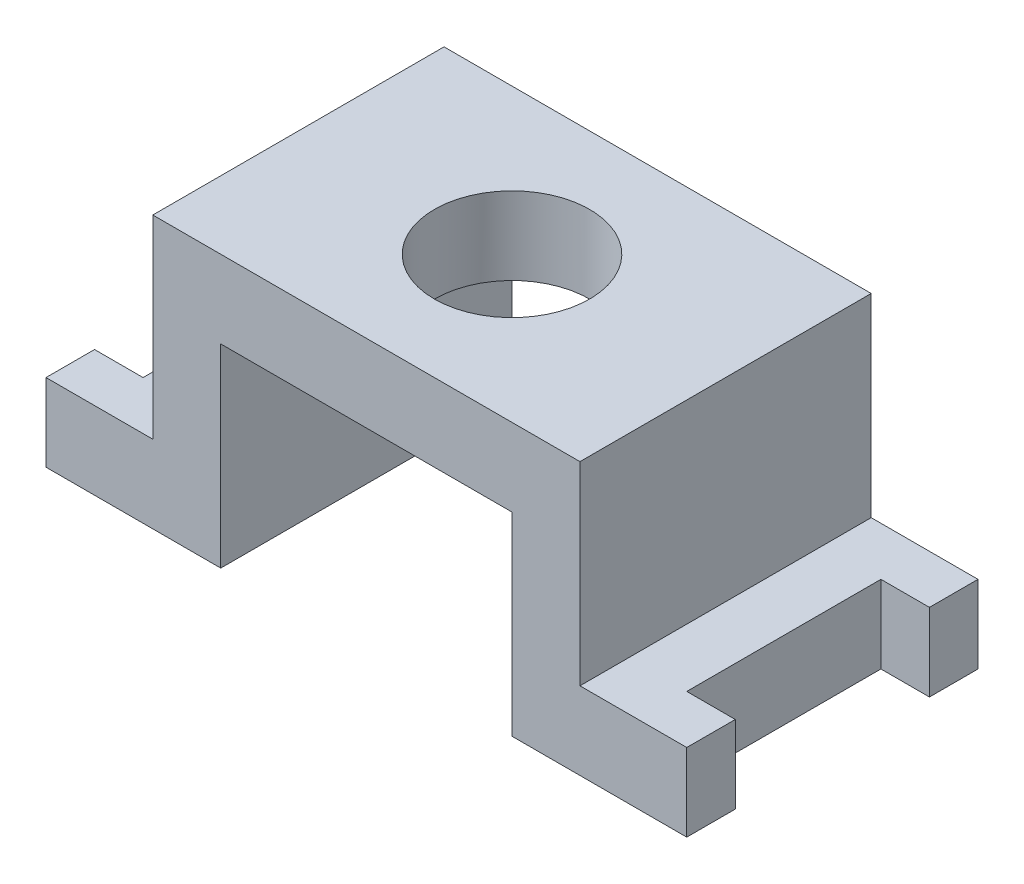
ISO-10303-21;
HEADER;
FILE_DESCRIPTION(('STEP AP214'),'2;1');
FILE_NAME('part.step','',(''),(''),'','','');
FILE_SCHEMA(('AUTOMOTIVE_DESIGN { 1 0 10303 214 1 1 1 1 }'));
ENDSEC;
DATA;
#1=APPLICATION_CONTEXT('core data for automotive mechanical design processes');
#2=APPLICATION_PROTOCOL_DEFINITION('international standard','automotive_design',2000,#1);
#3=PRODUCT_CONTEXT('',#1,'mechanical');
#4=PRODUCT('Part','Part','',(#3));
#5=PRODUCT_RELATED_PRODUCT_CATEGORY('part','',(#4));
#6=PRODUCT_DEFINITION_FORMATION('','',#4);
#7=PRODUCT_DEFINITION_CONTEXT('part definition',#1,'design');
#8=PRODUCT_DEFINITION('design','',#6,#7);
#9=PRODUCT_DEFINITION_SHAPE('','',#8);
#10=(LENGTH_UNIT() NAMED_UNIT(*) SI_UNIT(.MILLI.,.METRE.));
#11=(NAMED_UNIT(*) PLANE_ANGLE_UNIT() SI_UNIT($,.RADIAN.));
#12=(NAMED_UNIT(*) SI_UNIT($,.STERADIAN.) SOLID_ANGLE_UNIT());
#13=UNCERTAINTY_MEASURE_WITH_UNIT(LENGTH_MEASURE(1.E-05),#10,'distance_accuracy_value','');
#14=(GEOMETRIC_REPRESENTATION_CONTEXT(3) GLOBAL_UNCERTAINTY_ASSIGNED_CONTEXT((#13)) GLOBAL_UNIT_ASSIGNED_CONTEXT((#10,
#11,#12)) REPRESENTATION_CONTEXT('',''));
#15=CARTESIAN_POINT('',(0.,0.,0.));
#16=DIRECTION('',(0.,0.,1.));
#17=DIRECTION('',(1.,0.,0.));
#18=AXIS2_PLACEMENT_3D('',#15,#16,#17);
#19=CARTESIAN_POINT('',(66.,8.,30.));
#20=DIRECTION('',(-1.,0.,0.));
#21=DIRECTION('',(0.,-1.,0.));
#22=AXIS2_PLACEMENT_3D('',#19,#20,#21);
#23=PLANE('',#22);
#24=DIRECTION('',(0.,0.,-1.));
#25=VECTOR('',#24,1.);
#26=CARTESIAN_POINT('',(66.,0.,30.));
#27=LINE('',#26,#25);
#28=CARTESIAN_POINT('',(66.,0.,30.));
#29=VERTEX_POINT('',#28);
#30=CARTESIAN_POINT('',(66.,0.,25.));
#31=VERTEX_POINT('',#30);
#32=EDGE_CURVE('E263',#29,#31,#27,.T.);
#33=ORIENTED_EDGE('',*,*,#32,.T.);
#34=DIRECTION('',(0.,1.,0.));
#35=VECTOR('',#34,1.);
#36=CARTESIAN_POINT('',(66.,0.,25.));
#37=LINE('',#36,#35);
#38=CARTESIAN_POINT('',(66.,8.,25.));
#39=VERTEX_POINT('',#38);
#40=EDGE_CURVE('E372',#31,#39,#37,.T.);
#41=ORIENTED_EDGE('',*,*,#40,.T.);
#42=DIRECTION('',(0.,0.,-1.));
#43=VECTOR('',#42,1.);
#44=CARTESIAN_POINT('',(66.,8.,30.));
#45=LINE('',#44,#43);
#46=CARTESIAN_POINT('',(66.,8.,30.));
#47=VERTEX_POINT('',#46);
#48=EDGE_CURVE('E258',#47,#39,#45,.T.);
#49=ORIENTED_EDGE('',*,*,#48,.F.);
#50=DIRECTION('',(0.,1.,0.));
#51=VECTOR('',#50,1.);
#52=CARTESIAN_POINT('',(66.,8.,30.));
#53=LINE('',#52,#51);
#54=EDGE_CURVE('E433',#29,#47,#53,.T.);
#55=ORIENTED_EDGE('',*,*,#54,.F.);
#56=EDGE_LOOP('',(#33,#41,#49,#55));
#57=FACE_BOUND('',#56,.T.);
#58=ADVANCED_FACE('F45',(#57),#23,.F.);
#59=CARTESIAN_POINT('',(0.,0.,30.));
#60=DIRECTION('',(1.,0.,0.));
#61=DIRECTION('',(0.,0.,-1.));
#62=AXIS2_PLACEMENT_3D('',#59,#60,#61);
#63=PLANE('',#62);
#64=DIRECTION('',(0.,0.,-1.));
#65=VECTOR('',#64,1.);
#66=CARTESIAN_POINT('',(0.,0.,30.));
#67=LINE('',#66,#65);
#68=CARTESIAN_POINT('',(0.,0.,5.));
#69=VERTEX_POINT('',#68);
#70=CARTESIAN_POINT('',(0.,0.,0.));
#71=VERTEX_POINT('',#70);
#72=EDGE_CURVE('E232',#69,#71,#67,.T.);
#73=ORIENTED_EDGE('',*,*,#72,.F.);
#74=DIRECTION('',(0.,1.,0.));
#75=VECTOR('',#74,1.);
#76=CARTESIAN_POINT('',(0.,0.,5.));
#77=LINE('',#76,#75);
#78=CARTESIAN_POINT('',(0.,8.,5.));
#79=VERTEX_POINT('',#78);
#80=EDGE_CURVE('E411',#69,#79,#77,.T.);
#81=ORIENTED_EDGE('',*,*,#80,.T.);
#82=DIRECTION('',(0.,0.,-1.));
#83=VECTOR('',#82,1.);
#84=CARTESIAN_POINT('',(0.,8.,30.));
#85=LINE('',#84,#83);
#86=CARTESIAN_POINT('',(0.,8.,0.));
#87=VERTEX_POINT('',#86);
#88=EDGE_CURVE('E231',#79,#87,#85,.T.);
#89=ORIENTED_EDGE('',*,*,#88,.T.);
#90=DIRECTION('',(0.,-1.,0.));
#91=VECTOR('',#90,1.);
#92=CARTESIAN_POINT('',(0.,0.,0.));
#93=LINE('',#92,#91);
#94=EDGE_CURVE('E233',#87,#71,#93,.T.);
#95=ORIENTED_EDGE('',*,*,#94,.T.);
#96=EDGE_LOOP('',(#73,#81,#89,#95));
#97=FACE_BOUND('',#96,.T.);
#98=ADVANCED_FACE('F475',(#97),#63,.F.);
#99=CARTESIAN_POINT('',(18.,0.,30.));
#100=DIRECTION('',(0.,1.,0.));
#101=DIRECTION('',(-1.,0.,0.));
#102=AXIS2_PLACEMENT_3D('',#99,#100,#101);
#103=PLANE('',#102);
#104=DIRECTION('',(0.,0.,-1.));
#105=VECTOR('',#104,1.);
#106=CARTESIAN_POINT('',(5.,0.,25.));
#107=LINE('',#106,#105);
#108=CARTESIAN_POINT('',(5.,0.,25.));
#109=VERTEX_POINT('',#108);
#110=CARTESIAN_POINT('',(5.,0.,5.));
#111=VERTEX_POINT('',#110);
#112=EDGE_CURVE('E197',#109,#111,#107,.T.);
#113=ORIENTED_EDGE('',*,*,#112,.T.);
#114=DIRECTION('',(-1.,0.,0.));
#115=VECTOR('',#114,1.);
#116=CARTESIAN_POINT('',(0.,0.,5.));
#117=LINE('',#116,#115);
#118=EDGE_CURVE('E203',#111,#69,#117,.T.);
#119=ORIENTED_EDGE('',*,*,#118,.T.);
#120=ORIENTED_EDGE('',*,*,#72,.T.);
#121=DIRECTION('',(1.,0.,0.));
#122=VECTOR('',#121,1.);
#123=CARTESIAN_POINT('',(18.,0.,0.));
#124=LINE('',#123,#122);
#125=CARTESIAN_POINT('',(18.,0.,0.));
#126=VERTEX_POINT('',#125);
#127=EDGE_CURVE('E298',#71,#126,#124,.T.);
#128=ORIENTED_EDGE('',*,*,#127,.T.);
#129=DIRECTION('',(0.,0.,-1.));
#130=VECTOR('',#129,1.);
#131=CARTESIAN_POINT('',(18.,0.,30.));
#132=LINE('',#131,#130);
#133=CARTESIAN_POINT('',(18.,0.,30.));
#134=VERTEX_POINT('',#133);
#135=EDGE_CURVE('E12',#134,#126,#132,.T.);
#136=ORIENTED_EDGE('',*,*,#135,.F.);
#137=DIRECTION('',(1.,0.,0.));
#138=VECTOR('',#137,1.);
#139=CARTESIAN_POINT('',(18.,0.,30.));
#140=LINE('',#139,#138);
#141=CARTESIAN_POINT('',(0.,0.,30.));
#142=VERTEX_POINT('',#141);
#143=EDGE_CURVE('E329',#142,#134,#140,.T.);
#144=ORIENTED_EDGE('',*,*,#143,.F.);
#145=CARTESIAN_POINT('',(0.,0.,25.));
#146=VERTEX_POINT('',#145);
#147=EDGE_CURVE('E208',#142,#146,#67,.T.);
#148=ORIENTED_EDGE('',*,*,#147,.T.);
#149=DIRECTION('',(1.,0.,0.));
#150=VECTOR('',#149,1.);
#151=CARTESIAN_POINT('',(0.,0.,25.));
#152=LINE('',#151,#150);
#153=EDGE_CURVE('E70',#146,#109,#152,.T.);
#154=ORIENTED_EDGE('',*,*,#153,.T.);
#155=EDGE_LOOP('',(#113,#119,#120,#128,#136,#144,#148,#154));
#156=FACE_BOUND('',#155,.T.);
#157=ADVANCED_FACE('F47',(#156),#103,.F.);
#158=CARTESIAN_POINT('',(18.,20.,30.));
#159=DIRECTION('',(-1.,0.,0.));
#160=DIRECTION('',(0.,-1.,0.));
#161=AXIS2_PLACEMENT_3D('',#158,#159,#160);
#162=PLANE('',#161);
#163=DIRECTION('',(0.,1.,0.));
#164=VECTOR('',#163,1.);
#165=CARTESIAN_POINT('',(18.,20.,0.));
#166=LINE('',#165,#164);
#167=CARTESIAN_POINT('',(18.,20.,0.));
#168=VERTEX_POINT('',#167);
#169=EDGE_CURVE('E289',#126,#168,#166,.T.);
#170=ORIENTED_EDGE('',*,*,#169,.T.);
#171=DIRECTION('',(0.,0.,-1.));
#172=VECTOR('',#171,1.);
#173=CARTESIAN_POINT('',(18.,20.,30.));
#174=LINE('',#173,#172);
#175=CARTESIAN_POINT('',(18.,20.,30.));
#176=VERTEX_POINT('',#175);
#177=EDGE_CURVE('E55',#176,#168,#174,.T.);
#178=ORIENTED_EDGE('',*,*,#177,.F.);
#179=DIRECTION('',(0.,1.,0.));
#180=VECTOR('',#179,1.);
#181=CARTESIAN_POINT('',(18.,20.,30.));
#182=LINE('',#181,#180);
#183=EDGE_CURVE('E334',#134,#176,#182,.T.);
#184=ORIENTED_EDGE('',*,*,#183,.F.);
#185=ORIENTED_EDGE('',*,*,#135,.T.);
#186=EDGE_LOOP('',(#170,#178,#184,#185));
#187=FACE_BOUND('',#186,.T.);
#188=ADVANCED_FACE('F467',(#187),#162,.F.);
#189=CARTESIAN_POINT('',(48.,20.,30.));
#190=DIRECTION('',(0.,1.,0.));
#191=DIRECTION('',(-1.,0.,0.));
#192=AXIS2_PLACEMENT_3D('',#189,#190,#191);
#193=PLANE('',#192);
#194=CARTESIAN_POINT('',(33.,20.,15.));
#195=DIRECTION('',(0.,1.,0.));
#196=DIRECTION('',(-1.,0.,0.));
#197=AXIS2_PLACEMENT_3D('',#194,#195,#196);
#198=CIRCLE('',#197,8.);
#199=CARTESIAN_POINT('',(25.,20.,15.));
#200=VERTEX_POINT('',#199);
#201=EDGE_CURVE('E216',#200,#200,#198,.T.);
#202=ORIENTED_EDGE('',*,*,#201,.T.);
#203=EDGE_LOOP('',(#202));
#204=FACE_BOUND('',#203,.T.);
#205=DIRECTION('',(1.,0.,0.));
#206=VECTOR('',#205,1.);
#207=CARTESIAN_POINT('',(48.,20.,0.));
#208=LINE('',#207,#206);
#209=CARTESIAN_POINT('',(48.,20.,0.));
#210=VERTEX_POINT('',#209);
#211=EDGE_CURVE('E282',#168,#210,#208,.T.);
#212=ORIENTED_EDGE('',*,*,#211,.T.);
#213=DIRECTION('',(0.,0.,-1.));
#214=VECTOR('',#213,1.);
#215=CARTESIAN_POINT('',(48.,20.,30.));
#216=LINE('',#215,#214);
#217=CARTESIAN_POINT('',(48.,20.,30.));
#218=VERTEX_POINT('',#217);
#219=EDGE_CURVE('E271',#218,#210,#216,.T.);
#220=ORIENTED_EDGE('',*,*,#219,.F.);
#221=DIRECTION('',(1.,0.,0.));
#222=VECTOR('',#221,1.);
#223=CARTESIAN_POINT('',(48.,20.,30.));
#224=LINE('',#223,#222);
#225=EDGE_CURVE('E283',#176,#218,#224,.T.);
#226=ORIENTED_EDGE('',*,*,#225,.F.);
#227=ORIENTED_EDGE('',*,*,#177,.T.);
#228=EDGE_LOOP('',(#212,#220,#226,#227));
#229=FACE_BOUND('',#228,.T.);
#230=ADVANCED_FACE('F280',(#204,#229),#193,.F.);
#231=CARTESIAN_POINT('',(48.,0.,30.));
#232=DIRECTION('',(1.,0.,0.));
#233=DIRECTION('',(0.,0.,-1.));
#234=AXIS2_PLACEMENT_3D('',#231,#232,#233);
#235=PLANE('',#234);
#236=DIRECTION('',(0.,-1.,0.));
#237=VECTOR('',#236,1.);
#238=CARTESIAN_POINT('',(48.,0.,0.));
#239=LINE('',#238,#237);
#240=CARTESIAN_POINT('',(48.,0.,0.));
#241=VERTEX_POINT('',#240);
#242=EDGE_CURVE('E291',#210,#241,#239,.T.);
#243=ORIENTED_EDGE('',*,*,#242,.T.);
#244=DIRECTION('',(0.,0.,-1.));
#245=VECTOR('',#244,1.);
#246=CARTESIAN_POINT('',(48.,0.,30.));
#247=LINE('',#246,#245);
#248=CARTESIAN_POINT('',(48.,0.,30.));
#249=VERTEX_POINT('',#248);
#250=EDGE_CURVE('E267',#249,#241,#247,.T.);
#251=ORIENTED_EDGE('',*,*,#250,.F.);
#252=DIRECTION('',(0.,-1.,0.));
#253=VECTOR('',#252,1.);
#254=CARTESIAN_POINT('',(48.,0.,30.));
#255=LINE('',#254,#253);
#256=EDGE_CURVE('E438',#218,#249,#255,.T.);
#257=ORIENTED_EDGE('',*,*,#256,.F.);
#258=ORIENTED_EDGE('',*,*,#219,.T.);
#259=EDGE_LOOP('',(#243,#251,#257,#258));
#260=FACE_BOUND('',#259,.T.);
#261=ADVANCED_FACE('F445',(#260),#235,.F.);
#262=CARTESIAN_POINT('',(66.,0.,30.));
#263=DIRECTION('',(0.,1.,0.));
#264=DIRECTION('',(-1.,0.,0.));
#265=AXIS2_PLACEMENT_3D('',#262,#263,#264);
#266=PLANE('',#265);
#267=DIRECTION('',(0.,0.,1.));
#268=VECTOR('',#267,1.);
#269=CARTESIAN_POINT('',(61.,0.,25.));
#270=LINE('',#269,#268);
#271=CARTESIAN_POINT('',(61.,0.,5.));
#272=VERTEX_POINT('',#271);
#273=CARTESIAN_POINT('',(61.,0.,25.));
#274=VERTEX_POINT('',#273);
#275=EDGE_CURVE('E354',#272,#274,#270,.T.);
#276=ORIENTED_EDGE('',*,*,#275,.T.);
#277=DIRECTION('',(1.,0.,0.));
#278=VECTOR('',#277,1.);
#279=CARTESIAN_POINT('',(66.,0.,25.));
#280=LINE('',#279,#278);
#281=EDGE_CURVE('E359',#274,#31,#280,.T.);
#282=ORIENTED_EDGE('',*,*,#281,.T.);
#283=ORIENTED_EDGE('',*,*,#32,.F.);
#284=DIRECTION('',(1.,0.,0.));
#285=VECTOR('',#284,1.);
#286=CARTESIAN_POINT('',(66.,0.,30.));
#287=LINE('',#286,#285);
#288=EDGE_CURVE('E436',#249,#29,#287,.T.);
#289=ORIENTED_EDGE('',*,*,#288,.F.);
#290=ORIENTED_EDGE('',*,*,#250,.T.);
#291=DIRECTION('',(1.,0.,0.));
#292=VECTOR('',#291,1.);
#293=CARTESIAN_POINT('',(66.,0.,0.));
#294=LINE('',#293,#292);
#295=CARTESIAN_POINT('',(66.,0.,0.));
#296=VERTEX_POINT('',#295);
#297=EDGE_CURVE('E296',#241,#296,#294,.T.);
#298=ORIENTED_EDGE('',*,*,#297,.T.);
#299=CARTESIAN_POINT('',(66.,0.,5.));
#300=VERTEX_POINT('',#299);
#301=EDGE_CURVE('E262',#300,#296,#27,.T.);
#302=ORIENTED_EDGE('',*,*,#301,.F.);
#303=DIRECTION('',(-1.,0.,0.));
#304=VECTOR('',#303,1.);
#305=CARTESIAN_POINT('',(66.,0.,5.));
#306=LINE('',#305,#304);
#307=EDGE_CURVE('E350',#300,#272,#306,.T.);
#308=ORIENTED_EDGE('',*,*,#307,.T.);
#309=EDGE_LOOP('',(#276,#282,#283,#289,#290,#298,#302,#308));
#310=FACE_BOUND('',#309,.T.);
#311=ADVANCED_FACE('F449',(#310),#266,.F.);
#312=CARTESIAN_POINT('',(66.,8.,5.));
#313=VERTEX_POINT('',#312);
#314=CARTESIAN_POINT('',(66.,8.,0.));
#315=VERTEX_POINT('',#314);
#316=EDGE_CURVE('E257',#313,#315,#45,.T.);
#317=ORIENTED_EDGE('',*,*,#316,.F.);
#318=DIRECTION('',(0.,1.,0.));
#319=VECTOR('',#318,1.);
#320=CARTESIAN_POINT('',(66.,0.,5.));
#321=LINE('',#320,#319);
#322=EDGE_CURVE('E62',#300,#313,#321,.T.);
#323=ORIENTED_EDGE('',*,*,#322,.F.);
#324=ORIENTED_EDGE('',*,*,#301,.T.);
#325=DIRECTION('',(0.,1.,0.));
#326=VECTOR('',#325,1.);
#327=CARTESIAN_POINT('',(66.,8.,0.));
#328=LINE('',#327,#326);
#329=EDGE_CURVE('E305',#296,#315,#328,.T.);
#330=ORIENTED_EDGE('',*,*,#329,.T.);
#331=EDGE_LOOP('',(#317,#323,#324,#330));
#332=FACE_BOUND('',#331,.T.);
#333=ADVANCED_FACE('F478',(#332),#23,.F.);
#334=CARTESIAN_POINT('',(55.,8.,30.));
#335=DIRECTION('',(0.,-1.,0.));
#336=DIRECTION('',(0.,0.,-1.));
#337=AXIS2_PLACEMENT_3D('',#334,#335,#336);
#338=PLANE('',#337);
#339=ORIENTED_EDGE('',*,*,#48,.T.);
#340=DIRECTION('',(1.,0.,0.));
#341=VECTOR('',#340,1.);
#342=CARTESIAN_POINT('',(66.,8.,25.));
#343=LINE('',#342,#341);
#344=CARTESIAN_POINT('',(61.,8.,25.));
#345=VERTEX_POINT('',#344);
#346=EDGE_CURVE('E355',#345,#39,#343,.T.);
#347=ORIENTED_EDGE('',*,*,#346,.F.);
#348=DIRECTION('',(0.,0.,1.));
#349=VECTOR('',#348,1.);
#350=CARTESIAN_POINT('',(61.,8.,25.));
#351=LINE('',#350,#349);
#352=CARTESIAN_POINT('',(61.,8.,5.));
#353=VERTEX_POINT('',#352);
#354=EDGE_CURVE('E366',#353,#345,#351,.T.);
#355=ORIENTED_EDGE('',*,*,#354,.F.);
#356=DIRECTION('',(-1.,0.,0.));
#357=VECTOR('',#356,1.);
#358=CARTESIAN_POINT('',(66.,8.,5.));
#359=LINE('',#358,#357);
#360=EDGE_CURVE('E363',#313,#353,#359,.T.);
#361=ORIENTED_EDGE('',*,*,#360,.F.);
#362=ORIENTED_EDGE('',*,*,#316,.T.);
#363=DIRECTION('',(-1.,0.,0.));
#364=VECTOR('',#363,1.);
#365=CARTESIAN_POINT('',(55.,8.,0.));
#366=LINE('',#365,#364);
#367=CARTESIAN_POINT('',(55.,8.,0.));
#368=VERTEX_POINT('',#367);
#369=EDGE_CURVE('E309',#315,#368,#366,.T.);
#370=ORIENTED_EDGE('',*,*,#369,.T.);
#371=DIRECTION('',(0.,0.,-1.));
#372=VECTOR('',#371,1.);
#373=CARTESIAN_POINT('',(55.,8.,30.));
#374=LINE('',#373,#372);
#375=CARTESIAN_POINT('',(55.,8.,30.));
#376=VERTEX_POINT('',#375);
#377=EDGE_CURVE('E253',#376,#368,#374,.T.);
#378=ORIENTED_EDGE('',*,*,#377,.F.);
#379=DIRECTION('',(-1.,0.,0.));
#380=VECTOR('',#379,1.);
#381=CARTESIAN_POINT('',(55.,8.,30.));
#382=LINE('',#381,#380);
#383=EDGE_CURVE('E430',#47,#376,#382,.T.);
#384=ORIENTED_EDGE('',*,*,#383,.F.);
#385=EDGE_LOOP('',(#339,#347,#355,#361,#362,#370,#378,#384));
#386=FACE_BOUND('',#385,.T.);
#387=ADVANCED_FACE('F457',(#386),#338,.F.);
#388=CARTESIAN_POINT('',(55.,28.,30.));
#389=DIRECTION('',(-1.,0.,0.));
#390=DIRECTION('',(0.,0.,1.));
#391=AXIS2_PLACEMENT_3D('',#388,#389,#390);
#392=PLANE('',#391);
#393=DIRECTION('',(0.,1.,0.));
#394=VECTOR('',#393,1.);
#395=CARTESIAN_POINT('',(55.,28.,0.));
#396=LINE('',#395,#394);
#397=CARTESIAN_POINT('',(55.,28.,0.));
#398=VERTEX_POINT('',#397);
#399=EDGE_CURVE('E312',#368,#398,#396,.T.);
#400=ORIENTED_EDGE('',*,*,#399,.T.);
#401=DIRECTION('',(0.,0.,-1.));
#402=VECTOR('',#401,1.);
#403=CARTESIAN_POINT('',(55.,28.,30.));
#404=LINE('',#403,#402);
#405=CARTESIAN_POINT('',(55.,28.,30.));
#406=VERTEX_POINT('',#405);
#407=EDGE_CURVE('E249',#406,#398,#404,.T.);
#408=ORIENTED_EDGE('',*,*,#407,.F.);
#409=DIRECTION('',(0.,1.,0.));
#410=VECTOR('',#409,1.);
#411=CARTESIAN_POINT('',(55.,28.,30.));
#412=LINE('',#411,#410);
#413=EDGE_CURVE('E427',#376,#406,#412,.T.);
#414=ORIENTED_EDGE('',*,*,#413,.F.);
#415=ORIENTED_EDGE('',*,*,#377,.T.);
#416=EDGE_LOOP('',(#400,#408,#414,#415));
#417=FACE_BOUND('',#416,.T.);
#418=ADVANCED_FACE('F397',(#417),#392,.F.);
#419=CARTESIAN_POINT('',(11.,28.,30.));
#420=DIRECTION('',(0.,-1.,0.));
#421=DIRECTION('',(0.,0.,-1.));
#422=AXIS2_PLACEMENT_3D('',#419,#420,#421);
#423=PLANE('',#422);
#424=CARTESIAN_POINT('',(33.,28.,15.));
#425=DIRECTION('',(0.,1.,0.));
#426=DIRECTION('',(0.,0.,1.));
#427=AXIS2_PLACEMENT_3D('',#424,#425,#426);
#428=CIRCLE('',#427,8.);
#429=CARTESIAN_POINT('',(33.,28.,23.));
#430=VERTEX_POINT('',#429);
#431=EDGE_CURVE('E386',#430,#430,#428,.T.);
#432=ORIENTED_EDGE('',*,*,#431,.F.);
#433=EDGE_LOOP('',(#432));
#434=FACE_BOUND('',#433,.T.);
#435=DIRECTION('',(-1.,0.,0.));
#436=VECTOR('',#435,1.);
#437=CARTESIAN_POINT('',(11.,28.,0.));
#438=LINE('',#437,#436);
#439=CARTESIAN_POINT('',(11.,28.,0.));
#440=VERTEX_POINT('',#439);
#441=EDGE_CURVE('E315',#398,#440,#438,.T.);
#442=ORIENTED_EDGE('',*,*,#441,.T.);
#443=DIRECTION('',(0.,0.,-1.));
#444=VECTOR('',#443,1.);
#445=CARTESIAN_POINT('',(11.,28.,30.));
#446=LINE('',#445,#444);
#447=CARTESIAN_POINT('',(11.,28.,30.));
#448=VERTEX_POINT('',#447);
#449=EDGE_CURVE('E245',#448,#440,#446,.T.);
#450=ORIENTED_EDGE('',*,*,#449,.F.);
#451=DIRECTION('',(-1.,0.,0.));
#452=VECTOR('',#451,1.);
#453=CARTESIAN_POINT('',(11.,28.,30.));
#454=LINE('',#453,#452);
#455=EDGE_CURVE('E424',#406,#448,#454,.T.);
#456=ORIENTED_EDGE('',*,*,#455,.F.);
#457=ORIENTED_EDGE('',*,*,#407,.T.);
#458=EDGE_LOOP('',(#442,#450,#456,#457));
#459=FACE_BOUND('',#458,.T.);
#460=ADVANCED_FACE('F393',(#434,#459),#423,.F.);
#461=CARTESIAN_POINT('',(11.,8.,30.));
#462=DIRECTION('',(1.,0.,0.));
#463=DIRECTION('',(0.,0.,-1.));
#464=AXIS2_PLACEMENT_3D('',#461,#462,#463);
#465=PLANE('',#464);
#466=DIRECTION('',(0.,-1.,0.));
#467=VECTOR('',#466,1.);
#468=CARTESIAN_POINT('',(11.,8.,0.));
#469=LINE('',#468,#467);
#470=CARTESIAN_POINT('',(11.,8.,0.));
#471=VERTEX_POINT('',#470);
#472=EDGE_CURVE('E318',#440,#471,#469,.T.);
#473=ORIENTED_EDGE('',*,*,#472,.T.);
#474=DIRECTION('',(0.,0.,-1.));
#475=VECTOR('',#474,1.);
#476=CARTESIAN_POINT('',(11.,8.,30.));
#477=LINE('',#476,#475);
#478=CARTESIAN_POINT('',(11.,8.,30.));
#479=VERTEX_POINT('',#478);
#480=EDGE_CURVE('E241',#479,#471,#477,.T.);
#481=ORIENTED_EDGE('',*,*,#480,.F.);
#482=DIRECTION('',(0.,-1.,0.));
#483=VECTOR('',#482,1.);
#484=CARTESIAN_POINT('',(11.,8.,30.));
#485=LINE('',#484,#483);
#486=EDGE_CURVE('E408',#448,#479,#485,.T.);
#487=ORIENTED_EDGE('',*,*,#486,.F.);
#488=ORIENTED_EDGE('',*,*,#449,.T.);
#489=EDGE_LOOP('',(#473,#481,#487,#488));
#490=FACE_BOUND('',#489,.T.);
#491=ADVANCED_FACE('F396',(#490),#465,.F.);
#492=CARTESIAN_POINT('',(0.,8.,30.));
#493=DIRECTION('',(0.,-1.,0.));
#494=DIRECTION('',(0.,0.,-1.));
#495=AXIS2_PLACEMENT_3D('',#492,#493,#494);
#496=PLANE('',#495);
#497=ORIENTED_EDGE('',*,*,#88,.F.);
#498=DIRECTION('',(-1.,0.,0.));
#499=VECTOR('',#498,1.);
#500=CARTESIAN_POINT('',(0.,8.,5.));
#501=LINE('',#500,#499);
#502=CARTESIAN_POINT('',(5.,8.,5.));
#503=VERTEX_POINT('',#502);
#504=EDGE_CURVE('E210',#503,#79,#501,.T.);
#505=ORIENTED_EDGE('',*,*,#504,.F.);
#506=DIRECTION('',(0.,0.,-1.));
#507=VECTOR('',#506,1.);
#508=CARTESIAN_POINT('',(5.,8.,25.));
#509=LINE('',#508,#507);
#510=CARTESIAN_POINT('',(5.,8.,25.));
#511=VERTEX_POINT('',#510);
#512=EDGE_CURVE('E213',#511,#503,#509,.T.);
#513=ORIENTED_EDGE('',*,*,#512,.F.);
#514=DIRECTION('',(1.,0.,0.));
#515=VECTOR('',#514,1.);
#516=CARTESIAN_POINT('',(0.,8.,25.));
#517=LINE('',#516,#515);
#518=CARTESIAN_POINT('',(0.,8.,25.));
#519=VERTEX_POINT('',#518);
#520=EDGE_CURVE('E188',#519,#511,#517,.T.);
#521=ORIENTED_EDGE('',*,*,#520,.F.);
#522=CARTESIAN_POINT('',(0.,8.,30.));
#523=VERTEX_POINT('',#522);
#524=EDGE_CURVE('E236',#523,#519,#85,.T.);
#525=ORIENTED_EDGE('',*,*,#524,.F.);
#526=DIRECTION('',(-1.,0.,0.));
#527=VECTOR('',#526,1.);
#528=CARTESIAN_POINT('',(0.,8.,30.));
#529=LINE('',#528,#527);
#530=EDGE_CURVE('E419',#479,#523,#529,.T.);
#531=ORIENTED_EDGE('',*,*,#530,.F.);
#532=ORIENTED_EDGE('',*,*,#480,.T.);
#533=DIRECTION('',(-1.,0.,0.));
#534=VECTOR('',#533,1.);
#535=CARTESIAN_POINT('',(0.,8.,0.));
#536=LINE('',#535,#534);
#537=EDGE_CURVE('E320',#471,#87,#536,.T.);
#538=ORIENTED_EDGE('',*,*,#537,.T.);
#539=EDGE_LOOP('',(#497,#505,#513,#521,#525,#531,#532,#538));
#540=FACE_BOUND('',#539,.T.);
#541=ADVANCED_FACE('F463',(#540),#496,.F.);
#542=ORIENTED_EDGE('',*,*,#524,.T.);
#543=DIRECTION('',(0.,1.,0.));
#544=VECTOR('',#543,1.);
#545=CARTESIAN_POINT('',(0.,0.,25.));
#546=LINE('',#545,#544);
#547=EDGE_CURVE('E194',#146,#519,#546,.T.);
#548=ORIENTED_EDGE('',*,*,#547,.F.);
#549=ORIENTED_EDGE('',*,*,#147,.F.);
#550=DIRECTION('',(0.,-1.,0.));
#551=VECTOR('',#550,1.);
#552=CARTESIAN_POINT('',(0.,0.,30.));
#553=LINE('',#552,#551);
#554=EDGE_CURVE('E416',#523,#142,#553,.T.);
#555=ORIENTED_EDGE('',*,*,#554,.F.);
#556=EDGE_LOOP('',(#542,#548,#549,#555));
#557=FACE_BOUND('',#556,.T.);
#558=ADVANCED_FACE('F466',(#557),#63,.F.);
#559=CARTESIAN_POINT('',(0.,0.,30.));
#560=DIRECTION('',(0.,0.,-1.));
#561=DIRECTION('',(-1.,0.,0.));
#562=AXIS2_PLACEMENT_3D('',#559,#560,#561);
#563=PLANE('',#562);
#564=ORIENTED_EDGE('',*,*,#143,.T.);
#565=ORIENTED_EDGE('',*,*,#183,.T.);
#566=ORIENTED_EDGE('',*,*,#225,.T.);
#567=ORIENTED_EDGE('',*,*,#256,.T.);
#568=ORIENTED_EDGE('',*,*,#288,.T.);
#569=ORIENTED_EDGE('',*,*,#54,.T.);
#570=ORIENTED_EDGE('',*,*,#383,.T.);
#571=ORIENTED_EDGE('',*,*,#413,.T.);
#572=ORIENTED_EDGE('',*,*,#455,.T.);
#573=ORIENTED_EDGE('',*,*,#486,.T.);
#574=ORIENTED_EDGE('',*,*,#530,.T.);
#575=ORIENTED_EDGE('',*,*,#554,.T.);
#576=EDGE_LOOP('',(#564,#565,#566,#567,#568,#569,#570,#571,#572,#573,#574,#575));
#577=FACE_BOUND('',#576,.T.);
#578=ADVANCED_FACE('F443',(#577),#563,.F.);
#579=CARTESIAN_POINT('',(0.,0.,0.));
#580=DIRECTION('',(0.,0.,-1.));
#581=DIRECTION('',(-1.,0.,0.));
#582=AXIS2_PLACEMENT_3D('',#579,#580,#581);
#583=PLANE('',#582);
#584=ORIENTED_EDGE('',*,*,#127,.F.);
#585=ORIENTED_EDGE('',*,*,#94,.F.);
#586=ORIENTED_EDGE('',*,*,#537,.F.);
#587=ORIENTED_EDGE('',*,*,#472,.F.);
#588=ORIENTED_EDGE('',*,*,#441,.F.);
#589=ORIENTED_EDGE('',*,*,#399,.F.);
#590=ORIENTED_EDGE('',*,*,#369,.F.);
#591=ORIENTED_EDGE('',*,*,#329,.F.);
#592=ORIENTED_EDGE('',*,*,#297,.F.);
#593=ORIENTED_EDGE('',*,*,#242,.F.);
#594=ORIENTED_EDGE('',*,*,#211,.F.);
#595=ORIENTED_EDGE('',*,*,#169,.F.);
#596=EDGE_LOOP('',(#584,#585,#586,#587,#588,#589,#590,#591,#592,#593,#594,#595));
#597=FACE_BOUND('',#596,.T.);
#598=ADVANCED_FACE('F288',(#597),#583,.T.);
#599=CARTESIAN_POINT('',(0.,0.,5.));
#600=DIRECTION('',(0.,0.,-1.));
#601=DIRECTION('',(-1.,0.,0.));
#602=AXIS2_PLACEMENT_3D('',#599,#600,#601);
#603=PLANE('',#602);
#604=ORIENTED_EDGE('',*,*,#504,.T.);
#605=ORIENTED_EDGE('',*,*,#80,.F.);
#606=ORIENTED_EDGE('',*,*,#118,.F.);
#607=DIRECTION('',(0.,1.,0.));
#608=VECTOR('',#607,1.);
#609=CARTESIAN_POINT('',(5.,0.,5.));
#610=LINE('',#609,#608);
#611=EDGE_CURVE('E193',#111,#503,#610,.T.);
#612=ORIENTED_EDGE('',*,*,#611,.T.);
#613=EDGE_LOOP('',(#604,#605,#606,#612));
#614=FACE_BOUND('',#613,.T.);
#615=ADVANCED_FACE('F500',(#614),#603,.F.);
#616=CARTESIAN_POINT('',(5.,0.,25.));
#617=DIRECTION('',(1.,0.,0.));
#618=DIRECTION('',(0.,0.,-1.));
#619=AXIS2_PLACEMENT_3D('',#616,#617,#618);
#620=PLANE('',#619);
#621=ORIENTED_EDGE('',*,*,#512,.T.);
#622=ORIENTED_EDGE('',*,*,#611,.F.);
#623=ORIENTED_EDGE('',*,*,#112,.F.);
#624=DIRECTION('',(0.,1.,0.));
#625=VECTOR('',#624,1.);
#626=CARTESIAN_POINT('',(5.,0.,25.));
#627=LINE('',#626,#625);
#628=EDGE_CURVE('E184',#109,#511,#627,.T.);
#629=ORIENTED_EDGE('',*,*,#628,.T.);
#630=EDGE_LOOP('',(#621,#622,#623,#629));
#631=FACE_BOUND('',#630,.T.);
#632=ADVANCED_FACE('F198',(#631),#620,.F.);
#633=CARTESIAN_POINT('',(0.,0.,25.));
#634=DIRECTION('',(0.,0.,1.));
#635=DIRECTION('',(1.,0.,0.));
#636=AXIS2_PLACEMENT_3D('',#633,#634,#635);
#637=PLANE('',#636);
#638=ORIENTED_EDGE('',*,*,#520,.T.);
#639=ORIENTED_EDGE('',*,*,#628,.F.);
#640=ORIENTED_EDGE('',*,*,#153,.F.);
#641=ORIENTED_EDGE('',*,*,#547,.T.);
#642=EDGE_LOOP('',(#638,#639,#640,#641));
#643=FACE_BOUND('',#642,.T.);
#644=ADVANCED_FACE('F186',(#643),#637,.F.);
#645=CARTESIAN_POINT('',(66.,0.,25.));
#646=DIRECTION('',(0.,0.,1.));
#647=DIRECTION('',(1.,0.,0.));
#648=AXIS2_PLACEMENT_3D('',#645,#646,#647);
#649=PLANE('',#648);
#650=ORIENTED_EDGE('',*,*,#346,.T.);
#651=ORIENTED_EDGE('',*,*,#40,.F.);
#652=ORIENTED_EDGE('',*,*,#281,.F.);
#653=DIRECTION('',(0.,1.,0.));
#654=VECTOR('',#653,1.);
#655=CARTESIAN_POINT('',(61.,0.,25.));
#656=LINE('',#655,#654);
#657=EDGE_CURVE('E376',#274,#345,#656,.T.);
#658=ORIENTED_EDGE('',*,*,#657,.T.);
#659=EDGE_LOOP('',(#650,#651,#652,#658));
#660=FACE_BOUND('',#659,.T.);
#661=ADVANCED_FACE('F518',(#660),#649,.F.);
#662=CARTESIAN_POINT('',(61.,0.,25.));
#663=DIRECTION('',(-1.,0.,0.));
#664=DIRECTION('',(0.,0.,1.));
#665=AXIS2_PLACEMENT_3D('',#662,#663,#664);
#666=PLANE('',#665);
#667=ORIENTED_EDGE('',*,*,#354,.T.);
#668=ORIENTED_EDGE('',*,*,#657,.F.);
#669=ORIENTED_EDGE('',*,*,#275,.F.);
#670=DIRECTION('',(0.,1.,0.));
#671=VECTOR('',#670,1.);
#672=CARTESIAN_POINT('',(61.,0.,5.));
#673=LINE('',#672,#671);
#674=EDGE_CURVE('E378',#272,#353,#673,.T.);
#675=ORIENTED_EDGE('',*,*,#674,.T.);
#676=EDGE_LOOP('',(#667,#668,#669,#675));
#677=FACE_BOUND('',#676,.T.);
#678=ADVANCED_FACE('F521',(#677),#666,.F.);
#679=CARTESIAN_POINT('',(66.,0.,5.));
#680=DIRECTION('',(0.,0.,-1.));
#681=DIRECTION('',(-1.,0.,0.));
#682=AXIS2_PLACEMENT_3D('',#679,#680,#681);
#683=PLANE('',#682);
#684=ORIENTED_EDGE('',*,*,#360,.T.);
#685=ORIENTED_EDGE('',*,*,#674,.F.);
#686=ORIENTED_EDGE('',*,*,#307,.F.);
#687=ORIENTED_EDGE('',*,*,#322,.T.);
#688=EDGE_LOOP('',(#684,#685,#686,#687));
#689=FACE_BOUND('',#688,.T.);
#690=ADVANCED_FACE('F525',(#689),#683,.F.);
#691=CARTESIAN_POINT('',(33.,0.,15.));
#692=DIRECTION('',(0.,1.,0.));
#693=DIRECTION('',(0.,0.,1.));
#694=AXIS2_PLACEMENT_3D('',#691,#692,#693);
#695=CYLINDRICAL_SURFACE('',#694,8.);
#696=ORIENTED_EDGE('',*,*,#431,.T.);
#697=EDGE_LOOP('',(#696));
#698=FACE_BOUND('',#697,.T.);
#699=ORIENTED_EDGE('',*,*,#201,.F.);
#700=EDGE_LOOP('',(#699));
#701=FACE_BOUND('',#700,.T.);
#702=ADVANCED_FACE('F390',(#698,#701),#695,.F.);
#703=CLOSED_SHELL('',(#58,#98,#157,#188,#230,#261,#311,#333,#387,#418,#460,#491,#541,#558,#578,
#598,#615,#632,#644,#661,#678,#690,#702));
#704=MANIFOLD_SOLID_BREP('B2',#703);
#705=ADVANCED_BREP_SHAPE_REPRESENTATION('',(#18,#704),#14);
#706=SHAPE_DEFINITION_REPRESENTATION(#9,#705);
ENDSEC;
END-ISO-10303-21;
